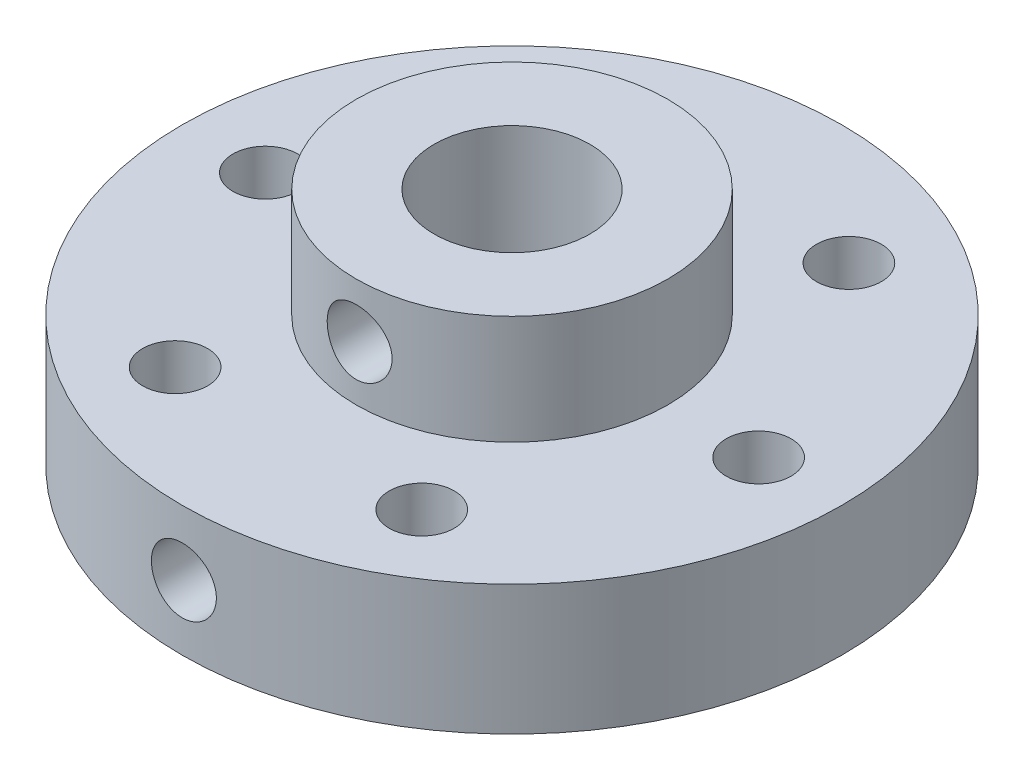
ISO-10303-21;
HEADER;
FILE_DESCRIPTION(('STEP AP214'),'2;1');
FILE_NAME('part.step','',(''),(''),'','','');
FILE_SCHEMA(('AUTOMOTIVE_DESIGN { 1 0 10303 214 1 1 1 1 }'));
ENDSEC;
DATA;
#1=APPLICATION_CONTEXT('core data for automotive mechanical design processes');
#2=APPLICATION_PROTOCOL_DEFINITION('international standard','automotive_design',2000,#1);
#3=PRODUCT_CONTEXT('',#1,'mechanical');
#4=PRODUCT('Part','Part','',(#3));
#5=PRODUCT_RELATED_PRODUCT_CATEGORY('part','',(#4));
#6=PRODUCT_DEFINITION_FORMATION('','',#4);
#7=PRODUCT_DEFINITION_CONTEXT('part definition',#1,'design');
#8=PRODUCT_DEFINITION('design','',#6,#7);
#9=PRODUCT_DEFINITION_SHAPE('','',#8);
#10=(LENGTH_UNIT() NAMED_UNIT(*) SI_UNIT(.MILLI.,.METRE.));
#11=(NAMED_UNIT(*) PLANE_ANGLE_UNIT() SI_UNIT($,.RADIAN.));
#12=(NAMED_UNIT(*) SI_UNIT($,.STERADIAN.) SOLID_ANGLE_UNIT());
#13=UNCERTAINTY_MEASURE_WITH_UNIT(LENGTH_MEASURE(1.E-05),#10,'distance_accuracy_value','');
#14=(GEOMETRIC_REPRESENTATION_CONTEXT(3) GLOBAL_UNCERTAINTY_ASSIGNED_CONTEXT((#13)) GLOBAL_UNIT_ASSIGNED_CONTEXT((#10,
#11,#12)) REPRESENTATION_CONTEXT('',''));
#15=CARTESIAN_POINT('',(0.,0.,0.));
#16=DIRECTION('',(0.,0.,1.));
#17=DIRECTION('',(1.,0.,0.));
#18=AXIS2_PLACEMENT_3D('',#15,#16,#17);
#19=CARTESIAN_POINT('',(12.7,0.,0.));
#20=DIRECTION('',(0.,-1.,0.));
#21=DIRECTION('',(0.,0.,-1.));
#22=AXIS2_PLACEMENT_3D('',#19,#20,#21);
#23=PLANE('',#22);
#24=CARTESIAN_POINT('',(-4.74999999999991,0.,-8.22724133595225));
#25=DIRECTION('',(0.,1.,0.));
#26=DIRECTION('',(0.,0.,1.));
#27=AXIS2_PLACEMENT_3D('',#24,#25,#26);
#28=CIRCLE('',#27,1.25);
#29=CARTESIAN_POINT('',(-4.74999999999991,0.,-6.97724133595225));
#30=VERTEX_POINT('',#29);
#31=EDGE_CURVE('E129',#30,#30,#28,.T.);
#32=ORIENTED_EDGE('',*,*,#31,.T.);
#33=EDGE_LOOP('',(#32));
#34=FACE_BOUND('',#33,.T.);
#35=CARTESIAN_POINT('',(4.75000000000025,0.,-8.2272413359522));
#36=DIRECTION('',(0.,1.,0.));
#37=DIRECTION('',(0.,0.,1.));
#38=AXIS2_PLACEMENT_3D('',#35,#36,#37);
#39=CIRCLE('',#38,1.25);
#40=CARTESIAN_POINT('',(4.75000000000025,0.,-6.9772413359522));
#41=VERTEX_POINT('',#40);
#42=EDGE_CURVE('E133',#41,#41,#39,.T.);
#43=ORIENTED_EDGE('',*,*,#42,.T.);
#44=EDGE_LOOP('',(#43));
#45=FACE_BOUND('',#44,.T.);
#46=CARTESIAN_POINT('',(9.50000000000026,0.,1.08637057683048E-13));
#47=DIRECTION('',(0.,1.,0.));
#48=DIRECTION('',(0.,0.,1.));
#49=AXIS2_PLACEMENT_3D('',#46,#47,#48);
#50=CIRCLE('',#49,1.25);
#51=CARTESIAN_POINT('',(9.50000000000026,0.,1.25000000000011));
#52=VERTEX_POINT('',#51);
#53=EDGE_CURVE('E137',#52,#52,#50,.T.);
#54=ORIENTED_EDGE('',*,*,#53,.T.);
#55=EDGE_LOOP('',(#54));
#56=FACE_BOUND('',#55,.T.);
#57=CARTESIAN_POINT('',(4.75000000000016,0.,8.22724133595238));
#58=DIRECTION('',(0.,1.,0.));
#59=DIRECTION('',(0.,0.,1.));
#60=AXIS2_PLACEMENT_3D('',#57,#58,#59);
#61=CIRCLE('',#60,1.25);
#62=CARTESIAN_POINT('',(4.75000000000016,0.,9.47724133595238));
#63=VERTEX_POINT('',#62);
#64=EDGE_CURVE('E141',#63,#63,#61,.T.);
#65=ORIENTED_EDGE('',*,*,#64,.T.);
#66=EDGE_LOOP('',(#65));
#67=FACE_BOUND('',#66,.T.);
#68=CARTESIAN_POINT('',(-4.74999999999999,0.,8.22724133595234));
#69=DIRECTION('',(0.,1.,0.));
#70=DIRECTION('',(0.,0.,1.));
#71=AXIS2_PLACEMENT_3D('',#68,#69,#70);
#72=CIRCLE('',#71,1.25);
#73=CARTESIAN_POINT('',(-4.74999999999999,0.,9.47724133595234));
#74=VERTEX_POINT('',#73);
#75=EDGE_CURVE('E145',#74,#74,#72,.T.);
#76=ORIENTED_EDGE('',*,*,#75,.T.);
#77=EDGE_LOOP('',(#76));
#78=FACE_BOUND('',#77,.T.);
#79=CARTESIAN_POINT('',(-9.5,0.,0.));
#80=DIRECTION('',(0.,1.,0.));
#81=DIRECTION('',(0.,0.,1.));
#82=AXIS2_PLACEMENT_3D('',#79,#80,#81);
#83=CIRCLE('',#82,1.25);
#84=CARTESIAN_POINT('',(-9.5,0.,1.25));
#85=VERTEX_POINT('',#84);
#86=EDGE_CURVE('E149',#85,#85,#83,.T.);
#87=ORIENTED_EDGE('',*,*,#86,.T.);
#88=EDGE_LOOP('',(#87));
#89=FACE_BOUND('',#88,.T.);
#90=CARTESIAN_POINT('',(0.,0.,0.));
#91=DIRECTION('',(0.,-1.,0.));
#92=DIRECTION('',(0.,0.,-1.));
#93=AXIS2_PLACEMENT_3D('',#90,#91,#92);
#94=CIRCLE('',#93,12.7);
#95=CARTESIAN_POINT('',(0.,0.,-12.7));
#96=VERTEX_POINT('',#95);
#97=EDGE_CURVE('E153',#96,#96,#94,.T.);
#98=ORIENTED_EDGE('',*,*,#97,.T.);
#99=EDGE_LOOP('',(#98));
#100=FACE_BOUND('',#99,.T.);
#101=CARTESIAN_POINT('',(0.,0.,0.));
#102=DIRECTION('',(0.,-1.,0.));
#103=DIRECTION('',(0.,0.,-1.));
#104=AXIS2_PLACEMENT_3D('',#101,#102,#103);
#105=CIRCLE('',#104,3.);
#106=CARTESIAN_POINT('',(0.,0.,-3.));
#107=VERTEX_POINT('',#106);
#108=EDGE_CURVE('E56',#107,#107,#105,.T.);
#109=ORIENTED_EDGE('',*,*,#108,.F.);
#110=EDGE_LOOP('',(#109));
#111=FACE_BOUND('',#110,.T.);
#112=ADVANCED_FACE('F43',(#34,#45,#56,#67,#78,#89,#100,#111),#23,.T.);
#113=CARTESIAN_POINT('',(0.,0.,0.));
#114=DIRECTION('',(0.,-1.,0.));
#115=DIRECTION('',(0.,0.,-1.));
#116=AXIS2_PLACEMENT_3D('',#113,#114,#115);
#117=CYLINDRICAL_SURFACE('',#116,3.);
#118=CARTESIAN_POINT('',(-1.24999999999999,7.1,2.72717802865893));
#119=CARTESIAN_POINT('',(-1.24999259066567,7.16667189089685,2.7271851956322));
#120=CARTESIAN_POINT('',(-1.24463203881502,7.23345265682621,2.72965859534401));
#121=CARTESIAN_POINT('',(-1.22339678947784,7.36508694205714,2.73923833650884));
#122=CARTESIAN_POINT('',(-1.20749354003276,7.42993472667523,2.74635725824267));
#123=CARTESIAN_POINT('',(-1.1658998841945,7.55556112969107,2.76426917574768));
#124=CARTESIAN_POINT('',(-1.14024937431427,7.61635516371501,2.77504717562616));
#125=CARTESIAN_POINT('',(-1.08000637754462,7.73275944957805,2.79904148565793));
#126=CARTESIAN_POINT('',(-1.04541600591531,7.78837092343312,2.81225721880783));
#127=CARTESIAN_POINT('',(-0.965973882676161,7.89632572497346,2.84055762619857));
#128=CARTESIAN_POINT('',(-0.920653238184403,7.94830755874409,2.85570568079146));
#129=CARTESIAN_POINT('',(-0.822021675745545,8.04420022249755,2.88564295372227));
#130=CARTESIAN_POINT('',(-0.768707691373999,8.08810794061301,2.90043203180789));
#131=CARTESIAN_POINT('',(-0.652763393797344,8.16844953087927,2.92875537930614));
#132=CARTESIAN_POINT('',(-0.589829293683655,8.20447662803234,2.94220739975291));
#133=CARTESIAN_POINT('',(-0.458132022362349,8.2652760205056,2.96556519993426));
#134=CARTESIAN_POINT('',(-0.389371454872121,8.29005331196421,2.97547255347157));
#135=CARTESIAN_POINT('',(-0.251768498025163,8.32633945875673,2.99017521042367));
#136=CARTESIAN_POINT('',(-0.183116576196079,8.33847169490204,2.99520971127466));
#137=CARTESIAN_POINT('',(-0.0445791803650053,8.35113764115985,3.00046828611204));
#138=CARTESIAN_POINT('',(0.0253057817645168,8.35167605588295,3.00069431131015));
#139=CARTESIAN_POINT('',(0.159792780112568,8.34146571906667,2.99645129133057));
#140=CARTESIAN_POINT('',(0.224457488607313,8.33140189947427,2.99226714648664));
#141=CARTESIAN_POINT('',(0.351082893931455,8.30144689736183,2.98006516750309));
#142=CARTESIAN_POINT('',(0.413043391054914,8.28155499036983,2.97204705074577));
#143=CARTESIAN_POINT('',(0.533638118077524,8.23227195910535,2.95279852414029));
#144=CARTESIAN_POINT('',(0.592207177074904,8.20274053712917,2.94152097126085));
#145=CARTESIAN_POINT('',(0.703711767281961,8.13515424329965,2.91685713989805));
#146=CARTESIAN_POINT('',(0.756645297756971,8.09709635915501,2.90347011666255));
#147=CARTESIAN_POINT('',(0.85934091170792,8.01041757959537,2.87481698777061));
#148=CARTESIAN_POINT('',(0.908616437316237,7.96124120872098,2.8594849435601));
#149=CARTESIAN_POINT('',(0.998431414927664,7.85528855929341,2.8293786068147));
#150=CARTESIAN_POINT('',(1.03896749582431,7.7985093617079,2.8146045313137));
#151=CARTESIAN_POINT('',(1.11140189250063,7.67660496333808,2.78681612355339));
#152=CARTESIAN_POINT('',(1.1429725335554,7.61126679425671,2.77387558556715));
#153=CARTESIAN_POINT('',(1.19446432058391,7.4755189550255,2.75209844221011));
#154=CARTESIAN_POINT('',(1.21439379627312,7.40511295173045,2.74325890334594));
#155=CARTESIAN_POINT('',(1.2408002516812,7.266103191086,2.73141212519724));
#156=CARTESIAN_POINT('',(1.24806614632865,7.19767887774094,2.72806369197117));
#157=CARTESIAN_POINT('',(1.25125630518998,7.0605215175885,2.72660286810642));
#158=CARTESIAN_POINT('',(1.24718449318148,6.99178858580829,2.72848866599319));
#159=CARTESIAN_POINT('',(1.22853477565555,6.86060161456955,2.7369313134575));
#160=CARTESIAN_POINT('',(1.21464618818048,6.7980273132132,2.74318138016618));
#161=CARTESIAN_POINT('',(1.17767058564225,6.67614870350213,2.75925630297447));
#162=CARTESIAN_POINT('',(1.15458142053124,6.61684516316929,2.76908199460161));
#163=CARTESIAN_POINT('',(1.09877520805186,6.50038468964353,2.79170797857));
#164=CARTESIAN_POINT('',(1.06569183306197,6.44342502538968,2.80461662202282));
#165=CARTESIAN_POINT('',(0.991200784385964,6.33559194750098,2.83180003740794));
#166=CARTESIAN_POINT('',(0.94978950787598,6.28472118329813,2.84607539920583));
#167=CARTESIAN_POINT('',(0.855844455715498,6.186199865116,2.87578619784533));
#168=CARTESIAN_POINT('',(0.802679661479732,6.13914860004934,2.89122146708842));
#169=CARTESIAN_POINT('',(0.688851512553533,6.05452770802067,2.92043361183923));
#170=CARTESIAN_POINT('',(0.628187608803651,6.0169587759363,2.93421036577014));
#171=CARTESIAN_POINT('',(0.50065468080338,5.95241012455643,2.9586425158565));
#172=CARTESIAN_POINT('',(0.433770169638502,5.92545775871053,2.96928983138826));
#173=CARTESIAN_POINT('',(0.295858835154413,5.88338320766558,2.98618173103366));
#174=CARTESIAN_POINT('',(0.224834504225192,5.86825398177394,2.9924289351992));
#175=CARTESIAN_POINT('',(0.0860165335064084,5.8511418744797,2.9995153479751));
#176=CARTESIAN_POINT('',(0.0183440847938956,5.84831400030304,3.00070204534225));
#177=CARTESIAN_POINT('',(-0.116486811714287,5.85361314129395,2.99849523480953));
#178=CARTESIAN_POINT('',(-0.183645347541156,5.86173823601287,2.99510252984313));
#179=CARTESIAN_POINT('',(-0.313086482449185,5.88810607215867,2.98430065981734));
#180=CARTESIAN_POINT('',(-0.375457537843569,5.90597968046956,2.97703824209233));
#181=CARTESIAN_POINT('',(-0.49629223050133,5.95093424720914,2.95929499847058));
#182=CARTESIAN_POINT('',(-0.554755122985826,5.97801695466491,2.94881356124207));
#183=CARTESIAN_POINT('',(-0.66902456547878,6.04198952921447,2.92505825398662));
#184=CARTESIAN_POINT('',(-0.724591657976681,6.079267301424,2.91167959188766));
#185=CARTESIAN_POINT('',(-0.828918675638779,6.1620071828719,2.88371561874231));
#186=CARTESIAN_POINT('',(-0.87767606178604,6.20747233040676,2.86912986083797));
#187=CARTESIAN_POINT('',(-0.970449787231577,6.30894482585441,2.83914845259141));
#188=CARTESIAN_POINT('',(-1.01391775364847,6.36545901462113,2.82376522857896));
#189=CARTESIAN_POINT('',(-1.09083332306674,6.4854587406802,2.79495552690186));
#190=CARTESIAN_POINT('',(-1.12427532456754,6.54894814805815,2.78153014522558));
#191=CARTESIAN_POINT('',(-1.17982766043577,6.68094383502275,2.75842557732643));
#192=CARTESIAN_POINT('',(-1.20199823632853,6.74942115879321,2.74872654469865));
#193=CARTESIAN_POINT('',(-1.234235564538,6.88953957385067,2.73440803066668));
#194=CARTESIAN_POINT('',(-1.24434291521209,6.9611692072743,2.72977151604981));
#195=CARTESIAN_POINT('',(-1.24940464923649,7.05535852426189,2.72744979732688));
#196=CARTESIAN_POINT('',(-1.25000248121118,7.07767315738803,2.72717562860875));
#197=CARTESIAN_POINT('',(-1.24999999999999,7.1,2.72717802865893));
#198=B_SPLINE_CURVE_WITH_KNOTS('',3,(#118,#119,#120,#121,#122,#123,#124,#125,#126,#127,#128,
#129,#130,#131,#132,#133,#134,#135,#136,#137,#138,#139,#140,#141,#142,#143,#144,#145,#146,#147,
#148,#149,#150,#151,#152,#153,#154,#155,#156,#157,#158,#159,#160,#161,#162,#163,#164,#165,#166,
#167,#168,#169,#170,#171,#172,#173,#174,#175,#176,#177,#178,#179,#180,#181,#182,#183,#184,#185,
#186,#187,#188,#189,#190,#191,#192,#193,#194,#195,#196,#197),.UNSPECIFIED.,.T.,.F.,(4,2,2,2,2,2,
2,2,2,2,2,2,2,2,2,2,2,2,2,2,2,2,2,2,2,2,2,2,2,2,2,2,2,2,2,2,2,2,2,4),(0.,0.199951711985514,
0.400447161842174,0.600130652152108,0.799766938550096,1.01066841430653,1.2216510045991,
1.44178476577923,1.6618206677489,1.87040605977951,2.07890680917929,2.27471840245092,
2.47054443201882,2.66935814640064,2.86824221022483,3.08114531844483,3.29413040441365,
3.5141154566672,3.73394290745567,3.93950778306306,4.14500152518447,4.3373390106619,
4.52972146913527,4.73025126818167,4.93086800795463,5.14781662735511,5.36478114041864,
5.58230105955592,5.79969134643005,6.0018863509405,6.20404590801911,6.39903415036484,
6.59405944632169,6.79789862829033,7.00181361048901,7.21960426908074,7.43751638139185,
7.65425125796861,7.87025464546159,7.93721375436701),.UNSPECIFIED.);
#199=CARTESIAN_POINT('',(-1.24999999999999,7.1,2.72717802865893));
#200=VERTEX_POINT('',#199);
#201=EDGE_CURVE('E93',#200,#200,#198,.T.);
#202=ORIENTED_EDGE('',*,*,#201,.F.);
#203=EDGE_LOOP('',(#202));
#204=FACE_BOUND('',#203,.T.);
#205=CARTESIAN_POINT('',(-1.24999999999999,2.5,2.72717802865893));
#206=CARTESIAN_POINT('',(-1.24999259066567,2.56667189089685,2.7271851956322));
#207=CARTESIAN_POINT('',(-1.24463203881502,2.63345265682621,2.72965859534401));
#208=CARTESIAN_POINT('',(-1.22339678947784,2.76508694205714,2.73923833650884));
#209=CARTESIAN_POINT('',(-1.20749354003276,2.82993472667523,2.74635725824267));
#210=CARTESIAN_POINT('',(-1.1658998841945,2.95556112969107,2.76426917574768));
#211=CARTESIAN_POINT('',(-1.14024937431427,3.01635516371501,2.77504717562616));
#212=CARTESIAN_POINT('',(-1.08000637754462,3.13275944957805,2.79904148565793));
#213=CARTESIAN_POINT('',(-1.04541600591531,3.18837092343312,2.81225721880783));
#214=CARTESIAN_POINT('',(-0.965973882676161,3.29632572497346,2.84055762619857));
#215=CARTESIAN_POINT('',(-0.920653238184403,3.34830755874409,2.85570568079146));
#216=CARTESIAN_POINT('',(-0.822021675745545,3.44420022249755,2.88564295372227));
#217=CARTESIAN_POINT('',(-0.768707691373999,3.48810794061301,2.90043203180789));
#218=CARTESIAN_POINT('',(-0.652763393797344,3.56844953087927,2.92875537930613));
#219=CARTESIAN_POINT('',(-0.589829293683655,3.60447662803234,2.94220739975291));
#220=CARTESIAN_POINT('',(-0.458132022362349,3.6652760205056,2.96556519993426));
#221=CARTESIAN_POINT('',(-0.389371454872121,3.69005331196421,2.97547255347157));
#222=CARTESIAN_POINT('',(-0.251768498025164,3.72633945875673,2.99017521042367));
#223=CARTESIAN_POINT('',(-0.183116576196079,3.73847169490204,2.99520971127466));
#224=CARTESIAN_POINT('',(-0.0445791803650054,3.75113764115985,3.00046828611204));
#225=CARTESIAN_POINT('',(0.0253057817645166,3.75167605588295,3.00069431131015));
#226=CARTESIAN_POINT('',(0.159792780112568,3.74146571906667,2.99645129133057));
#227=CARTESIAN_POINT('',(0.224457488607313,3.73140189947427,2.99226714648664));
#228=CARTESIAN_POINT('',(0.351082893931455,3.70144689736183,2.98006516750309));
#229=CARTESIAN_POINT('',(0.413043391054914,3.68155499036983,2.97204705074577));
#230=CARTESIAN_POINT('',(0.533638118077523,3.63227195910535,2.95279852414029));
#231=CARTESIAN_POINT('',(0.592207177074903,3.60274053712917,2.94152097126085));
#232=CARTESIAN_POINT('',(0.70371176728196,3.53515424329965,2.91685713989805));
#233=CARTESIAN_POINT('',(0.756645297756971,3.49709635915501,2.90347011666255));
#234=CARTESIAN_POINT('',(0.85934091170792,3.41041757959538,2.87481698777061));
#235=CARTESIAN_POINT('',(0.908616437316236,3.36124120872099,2.8594849435601));
#236=CARTESIAN_POINT('',(0.998431414927663,3.25528855929341,2.8293786068147));
#237=CARTESIAN_POINT('',(1.03896749582431,3.1985093617079,2.8146045313137));
#238=CARTESIAN_POINT('',(1.11140189250063,3.07660496333808,2.78681612355339));
#239=CARTESIAN_POINT('',(1.1429725335554,3.01126679425671,2.77387558556715));
#240=CARTESIAN_POINT('',(1.19446432058391,2.8755189550255,2.75209844221011));
#241=CARTESIAN_POINT('',(1.21439379627312,2.80511295173045,2.74325890334594));
#242=CARTESIAN_POINT('',(1.2408002516812,2.666103191086,2.73141212519724));
#243=CARTESIAN_POINT('',(1.24806614632865,2.59767887774095,2.72806369197117));
#244=CARTESIAN_POINT('',(1.25125630518998,2.4605215175885,2.72660286810642));
#245=CARTESIAN_POINT('',(1.24718449318148,2.39178858580829,2.72848866599319));
#246=CARTESIAN_POINT('',(1.22853477565555,2.26060161456955,2.73693131345749));
#247=CARTESIAN_POINT('',(1.21464618818048,2.1980273132132,2.74318138016618));
#248=CARTESIAN_POINT('',(1.17767058564225,2.07614870350213,2.75925630297447));
#249=CARTESIAN_POINT('',(1.15458142053124,2.01684516316929,2.76908199460161));
#250=CARTESIAN_POINT('',(1.09877520805186,1.90038468964353,2.79170797857));
#251=CARTESIAN_POINT('',(1.06569183306197,1.84342502538968,2.80461662202282));
#252=CARTESIAN_POINT('',(0.991200784385964,1.73559194750098,2.83180003740794));
#253=CARTESIAN_POINT('',(0.949789507875981,1.68472118329813,2.84607539920583));
#254=CARTESIAN_POINT('',(0.855844455715499,1.586199865116,2.87578619784533));
#255=CARTESIAN_POINT('',(0.802679661479732,1.53914860004934,2.89122146708842));
#256=CARTESIAN_POINT('',(0.688851512553533,1.45452770802067,2.92043361183923));
#257=CARTESIAN_POINT('',(0.628187608803651,1.4169587759363,2.93421036577014));
#258=CARTESIAN_POINT('',(0.50065468080338,1.35241012455643,2.9586425158565));
#259=CARTESIAN_POINT('',(0.433770169638502,1.32545775871053,2.96928983138826));
#260=CARTESIAN_POINT('',(0.295858835154413,1.28338320766558,2.98618173103366));
#261=CARTESIAN_POINT('',(0.224834504225192,1.26825398177394,2.9924289351992));
#262=CARTESIAN_POINT('',(0.0860165335064089,1.2511418744797,2.9995153479751));
#263=CARTESIAN_POINT('',(0.0183440847938962,1.24831400030304,3.00070204534225));
#264=CARTESIAN_POINT('',(-0.116486811714286,1.25361314129395,2.99849523480953));
#265=CARTESIAN_POINT('',(-0.183645347541156,1.26173823601287,2.99510252984313));
#266=CARTESIAN_POINT('',(-0.313086482449185,1.28810607215867,2.98430065981734));
#267=CARTESIAN_POINT('',(-0.375457537843569,1.30597968046956,2.97703824209233));
#268=CARTESIAN_POINT('',(-0.49629223050133,1.35093424720914,2.95929499847058));
#269=CARTESIAN_POINT('',(-0.554755122985826,1.37801695466491,2.94881356124207));
#270=CARTESIAN_POINT('',(-0.66902456547878,1.44198952921447,2.92505825398662));
#271=CARTESIAN_POINT('',(-0.72459165797668,1.479267301424,2.91167959188766));
#272=CARTESIAN_POINT('',(-0.828918675638779,1.5620071828719,2.88371561874231));
#273=CARTESIAN_POINT('',(-0.87767606178604,1.60747233040676,2.86912986083797));
#274=CARTESIAN_POINT('',(-0.970449787231577,1.70894482585441,2.83914845259141));
#275=CARTESIAN_POINT('',(-1.01391775364847,1.76545901462113,2.82376522857896));
#276=CARTESIAN_POINT('',(-1.09083332306674,1.8854587406802,2.79495552690186));
#277=CARTESIAN_POINT('',(-1.12427532456754,1.94894814805815,2.78153014522558));
#278=CARTESIAN_POINT('',(-1.17982766043576,2.08094383502276,2.75842557732643));
#279=CARTESIAN_POINT('',(-1.20199823632853,2.14942115879321,2.74872654469865));
#280=CARTESIAN_POINT('',(-1.234235564538,2.28953957385067,2.73440803066668));
#281=CARTESIAN_POINT('',(-1.24434291521209,2.3611692072743,2.72977151604981));
#282=CARTESIAN_POINT('',(-1.24940464923649,2.45535852426189,2.72744979732688));
#283=CARTESIAN_POINT('',(-1.25000248121118,2.47767315738804,2.72717562860875));
#284=CARTESIAN_POINT('',(-1.24999999999999,2.5,2.72717802865893));
#285=B_SPLINE_CURVE_WITH_KNOTS('',3,(#205,#206,#207,#208,#209,#210,#211,#212,#213,#214,#215,
#216,#217,#218,#219,#220,#221,#222,#223,#224,#225,#226,#227,#228,#229,#230,#231,#232,#233,#234,
#235,#236,#237,#238,#239,#240,#241,#242,#243,#244,#245,#246,#247,#248,#249,#250,#251,#252,#253,
#254,#255,#256,#257,#258,#259,#260,#261,#262,#263,#264,#265,#266,#267,#268,#269,#270,#271,#272,
#273,#274,#275,#276,#277,#278,#279,#280,#281,#282,#283,#284),.UNSPECIFIED.,.T.,.F.,(4,2,2,2,2,2,
2,2,2,2,2,2,2,2,2,2,2,2,2,2,2,2,2,2,2,2,2,2,2,2,2,2,2,2,2,2,2,2,2,4),(0.,0.199951711985514,
0.400447161842173,0.600130652152108,0.799766938550096,1.01066841430653,1.2216510045991,
1.44178476577923,1.6618206677489,1.87040605977951,2.07890680917929,2.27471840245092,
2.47054443201882,2.66935814640064,2.86824221022482,3.08114531844483,3.29413040441365,
3.5141154566672,3.73394290745567,3.93950778306305,4.14500152518446,4.3373390106619,
4.52972146913527,4.73025126818167,4.93086800795463,5.14781662735511,5.36478114041864,
5.58230105955592,5.79969134643004,6.0018863509405,6.20404590801911,6.39903415036484,
6.59405944632169,6.79789862829033,7.00181361048901,7.21960426908074,7.43751638139185,
7.65425125796861,7.87025464546159,7.93721375436701),.UNSPECIFIED.);
#286=CARTESIAN_POINT('',(-1.24999999999999,2.5,2.72717802865893));
#287=VERTEX_POINT('',#286);
#288=EDGE_CURVE('E84',#287,#287,#285,.T.);
#289=ORIENTED_EDGE('',*,*,#288,.F.);
#290=EDGE_LOOP('',(#289));
#291=FACE_BOUND('',#290,.T.);
#292=ORIENTED_EDGE('',*,*,#108,.T.);
#293=EDGE_LOOP('',(#292));
#294=FACE_BOUND('',#293,.T.);
#295=CARTESIAN_POINT('',(0.,9.2,0.));
#296=DIRECTION('',(0.,-1.,0.));
#297=DIRECTION('',(0.,0.,-1.));
#298=AXIS2_PLACEMENT_3D('',#295,#296,#297);
#299=CIRCLE('',#298,3.);
#300=CARTESIAN_POINT('',(0.,9.2,-3.));
#301=VERTEX_POINT('',#300);
#302=EDGE_CURVE('E61',#301,#301,#299,.T.);
#303=ORIENTED_EDGE('',*,*,#302,.F.);
#304=EDGE_LOOP('',(#303));
#305=FACE_BOUND('',#304,.T.);
#306=ADVANCED_FACE('F98',(#204,#291,#294,#305),#117,.F.);
#307=CARTESIAN_POINT('',(3.,9.2,0.));
#308=DIRECTION('',(0.,1.,0.));
#309=DIRECTION('',(0.,0.,1.));
#310=AXIS2_PLACEMENT_3D('',#307,#308,#309);
#311=PLANE('',#310);
#312=ORIENTED_EDGE('',*,*,#302,.T.);
#313=EDGE_LOOP('',(#312));
#314=FACE_BOUND('',#313,.T.);
#315=CARTESIAN_POINT('',(0.,9.2,0.));
#316=DIRECTION('',(0.,-1.,0.));
#317=DIRECTION('',(0.,0.,-1.));
#318=AXIS2_PLACEMENT_3D('',#315,#316,#317);
#319=CIRCLE('',#318,6.);
#320=CARTESIAN_POINT('',(0.,9.2,-6.));
#321=VERTEX_POINT('',#320);
#322=EDGE_CURVE('E160',#321,#321,#319,.T.);
#323=ORIENTED_EDGE('',*,*,#322,.F.);
#324=EDGE_LOOP('',(#323));
#325=FACE_BOUND('',#324,.T.);
#326=ADVANCED_FACE('F102',(#314,#325),#311,.T.);
#327=CARTESIAN_POINT('',(0.,0.,0.));
#328=DIRECTION('',(0.,-1.,0.));
#329=DIRECTION('',(0.,0.,-1.));
#330=AXIS2_PLACEMENT_3D('',#327,#328,#329);
#331=CYLINDRICAL_SURFACE('',#330,6.);
#332=CARTESIAN_POINT('',(-1.24999999999999,7.1,5.86834729715275));
#333=CARTESIAN_POINT('',(-1.24999750877599,7.03060938484897,5.86834869213645));
#334=CARTESIAN_POINT('',(-1.24420229433947,6.96118802798478,5.86959145924544));
#335=CARTESIAN_POINT('',(-1.22119649233778,6.82431368268275,5.87442015581798));
#336=CARTESIAN_POINT('',(-1.20397715440341,6.75686224449358,5.87800788138388));
#337=CARTESIAN_POINT('',(-1.1586839750723,6.62592762716513,5.8871029296193));
#338=CARTESIAN_POINT('',(-1.13062141248932,6.5624404040082,5.89260825706945));
#339=CARTESIAN_POINT('',(-1.06446988601732,6.4410755003544,5.90491581335741));
#340=CARTESIAN_POINT('',(-1.02638132735819,6.38319759326998,5.91171798977623));
#341=CARTESIAN_POINT('',(-0.940636399466078,6.27380462484654,5.92596934661468));
#342=CARTESIAN_POINT('',(-0.892855554869664,6.22238810637353,5.93342614373039));
#343=CARTESIAN_POINT('',(-0.789351223880632,6.1282389313519,5.94807966802575));
#344=CARTESIAN_POINT('',(-0.733627155455998,6.08550691170856,5.95527637609915));
#345=CARTESIAN_POINT('',(-0.615162052999585,6.00955411191714,5.96868135118848));
#346=CARTESIAN_POINT('',(-0.552359428204938,5.97642747353674,5.97487958631242));
#347=CARTESIAN_POINT('',(-0.421928551006718,5.92123394714023,5.98550347343302));
#348=CARTESIAN_POINT('',(-0.354300789950589,5.89916593484647,5.98992930561222));
#349=CARTESIAN_POINT('',(-0.217162904200501,5.86702423888253,5.99645589892179));
#350=CARTESIAN_POINT('',(-0.147693380916357,5.85678398280484,5.99858891959926));
#351=CARTESIAN_POINT('',(-0.00799184883952444,5.84806830424299,6.00040112580612));
#352=CARTESIAN_POINT('',(0.0622400797368381,5.8495916558069,6.0000805670369));
#353=CARTESIAN_POINT('',(0.200326586199571,5.86423460095675,5.99704658090511));
#354=CARTESIAN_POINT('',(0.268201128726474,5.87717471895812,5.99437018956584));
#355=CARTESIAN_POINT('',(0.40079374628975,5.91399862533131,5.98696720898885));
#356=CARTESIAN_POINT('',(0.46551168751102,5.93788287720308,5.98224053291904));
#357=CARTESIAN_POINT('',(0.590460005384681,5.9960800521255,5.97120767323924));
#358=CARTESIAN_POINT('',(0.650657134981647,6.03046229420966,5.96489104125346));
#359=CARTESIAN_POINT('',(0.764493456510645,6.10862800284042,5.95137300440189));
#360=CARTESIAN_POINT('',(0.818131831816415,6.15241263820613,5.94417148958325));
#361=CARTESIAN_POINT('',(0.918394203276908,6.24912162489106,5.92951700233276));
#362=CARTESIAN_POINT('',(0.964866487494789,6.30220305998195,5.92206184975925));
#363=CARTESIAN_POINT('',(1.04827597240487,6.4154820489948,5.90786872648996));
#364=CARTESIAN_POINT('',(1.08521296069979,6.47567976138724,5.9011307717716));
#365=CARTESIAN_POINT('',(1.14856217138454,6.6017122548288,5.88912998409156));
#366=CARTESIAN_POINT('',(1.17494805489727,6.66756065069343,5.88387085232125));
#367=CARTESIAN_POINT('',(1.21623577538672,6.80289161936938,5.8754760641036));
#368=CARTESIAN_POINT('',(1.23113924882348,6.87237367280809,5.87234010507182));
#369=CARTESIAN_POINT('',(1.24880863867017,7.0116197063189,5.86860783239132));
#370=CARTESIAN_POINT('',(1.25179442917998,7.08135458453703,5.86796551863474));
#371=CARTESIAN_POINT('',(1.24613693439294,7.22032581154014,5.86916952018704));
#372=CARTESIAN_POINT('',(1.23749436857862,7.28956219090233,5.87101568152624));
#373=CARTESIAN_POINT('',(1.20901558325483,7.42482051605812,5.87694538226166));
#374=CARTESIAN_POINT('',(1.18929841376871,7.49086866717883,5.88100511282998));
#375=CARTESIAN_POINT('',(1.13935810860919,7.6187239894416,5.8908833850312));
#376=CARTESIAN_POINT('',(1.10913404556146,7.6805307856504,5.89670208191057));
#377=CARTESIAN_POINT('',(1.03854598181484,7.79910644121622,5.90954501937191));
#378=CARTESIAN_POINT('',(0.998045327353957,7.85579220446616,5.91658506648323));
#379=CARTESIAN_POINT('',(0.908234440569875,7.96164324915506,5.93103483993908));
#380=CARTESIAN_POINT('',(0.858923220505169,8.01080768623922,5.93844460766532));
#381=CARTESIAN_POINT('',(0.751900450843336,8.10106271309716,5.95294924316736));
#382=CARTESIAN_POINT('',(0.694061907614549,8.14200409502637,5.9600367471991));
#383=CARTESIAN_POINT('',(0.572200102216357,8.21358875208797,5.97296708772407));
#384=CARTESIAN_POINT('',(0.508177113476879,8.24423248223744,5.97880997920818));
#385=CARTESIAN_POINT('',(0.376142117847917,8.29413867931734,5.98856148270679));
#386=CARTESIAN_POINT('',(0.308156710970193,8.31346916554433,5.99248163136497));
#387=CARTESIAN_POINT('',(0.169813400503472,8.34041440400809,5.99799561410226));
#388=CARTESIAN_POINT('',(0.0994558094616954,8.34803069353273,5.99958975342889));
#389=CARTESIAN_POINT('',(-0.0402133434703382,8.35126762204851,6.00026408056941));
#390=CARTESIAN_POINT('',(-0.109519592177921,8.34711189999472,5.99939113754811));
#391=CARTESIAN_POINT('',(-0.246422870373551,8.32741936134706,5.99532874094472));
#392=CARTESIAN_POINT('',(-0.314019925202701,8.31188271359322,5.99213932172839));
#393=CARTESIAN_POINT('',(-0.445431965492049,8.26997220535143,5.98380460077544));
#394=CARTESIAN_POINT('',(-0.50925655000452,8.24362733614689,5.97866453407556));
#395=CARTESIAN_POINT('',(-0.631610567220737,8.18087760226799,5.96697995347704));
#396=CARTESIAN_POINT('',(-0.690139538279507,8.14447186165686,5.96043531730246));
#397=CARTESIAN_POINT('',(-0.801340321298256,8.06189033200669,5.94651596786386));
#398=CARTESIAN_POINT('',(-0.853892633615922,8.01555571194329,5.93912880302851));
#399=CARTESIAN_POINT('',(-0.95055274198038,7.91475549900291,5.9244278681135));
#400=CARTESIAN_POINT('',(-0.994658521571227,7.86028797005156,5.91711411595368));
#401=CARTESIAN_POINT('',(-1.07367451852767,7.74399089756656,5.90329191643327));
#402=CARTESIAN_POINT('',(-1.10846928126993,7.6820815885379,5.89679406702551));
#403=CARTESIAN_POINT('',(-1.16710627925306,7.55317484391673,5.88547039658063));
#404=CARTESIAN_POINT('',(-1.19095816292459,7.48618195154699,5.88064310352601));
#405=CARTESIAN_POINT('',(-1.2225655413186,7.36589371843156,5.87414004405196));
#406=CARTESIAN_POINT('',(-1.2328344900567,7.31327046340694,5.87198163591589));
#407=CARTESIAN_POINT('',(-1.24655254358403,7.20710421947899,5.86908475266778));
#408=CARTESIAN_POINT('',(-1.2500019229274,7.15356126768995,5.86834622039193));
#409=CARTESIAN_POINT('',(-1.24999999999999,7.1,5.86834729715275));
#410=B_SPLINE_CURVE_WITH_KNOTS('',3,(#332,#333,#334,#335,#336,#337,#338,#339,#340,#341,#342,
#343,#344,#345,#346,#347,#348,#349,#350,#351,#352,#353,#354,#355,#356,#357,#358,#359,#360,#361,
#362,#363,#364,#365,#366,#367,#368,#369,#370,#371,#372,#373,#374,#375,#376,#377,#378,#379,#380,
#381,#382,#383,#384,#385,#386,#387,#388,#389,#390,#391,#392,#393,#394,#395,#396,#397,#398,#399,
#400,#401,#402,#403,#404,#405,#406,#407,#408,#409),.UNSPECIFIED.,.T.,.F.,(4,2,2,2,2,2,2,2,2,2,2,
2,2,2,2,2,2,2,2,2,2,2,2,2,2,2,2,2,2,2,2,2,2,2,2,2,2,2,4),(0.,0.207975654071269,
0.416110792417468,0.624030014802726,0.831940834815787,1.04271333467884,1.25350128663873,
1.46629026266843,1.67905760106932,1.88879048859263,2.09850151896338,2.3049734141646,
2.51145405455869,2.71932871977948,2.92722924104258,3.13905862244912,3.35089272191626,
3.56325237332486,3.77558175387595,3.9839751600979,4.19235567296522,4.3985378623192,
4.60473825464028,4.81383917934648,5.02296356082183,5.23559458753341,5.44821621759037,
5.65954599648531,5.87084803959578,6.07816293922642,6.28547476332978,6.49223410585097,
6.6990114552817,6.9093831897857,7.11980508427532,7.33272651358119,7.54545984571984,
7.70599867585766,7.86653104261157),.UNSPECIFIED.);
#411=CARTESIAN_POINT('',(-1.24999999999999,7.1,5.86834729715275));
#412=VERTEX_POINT('',#411);
#413=EDGE_CURVE('E46',#412,#412,#410,.T.);
#414=ORIENTED_EDGE('',*,*,#413,.F.);
#415=EDGE_LOOP('',(#414));
#416=FACE_BOUND('',#415,.T.);
#417=ORIENTED_EDGE('',*,*,#322,.T.);
#418=EDGE_LOOP('',(#417));
#419=FACE_BOUND('',#418,.T.);
#420=CARTESIAN_POINT('',(0.,5.,0.));
#421=DIRECTION('',(0.,-1.,0.));
#422=DIRECTION('',(0.,0.,-1.));
#423=AXIS2_PLACEMENT_3D('',#420,#421,#422);
#424=CIRCLE('',#423,6.);
#425=CARTESIAN_POINT('',(0.,5.,-6.));
#426=VERTEX_POINT('',#425);
#427=EDGE_CURVE('E163',#426,#426,#424,.T.);
#428=ORIENTED_EDGE('',*,*,#427,.F.);
#429=EDGE_LOOP('',(#428));
#430=FACE_BOUND('',#429,.T.);
#431=ADVANCED_FACE('F106',(#416,#419,#430),#331,.T.);
#432=CARTESIAN_POINT('',(6.,5.,0.));
#433=DIRECTION('',(0.,1.,0.));
#434=DIRECTION('',(0.,0.,1.));
#435=AXIS2_PLACEMENT_3D('',#432,#433,#434);
#436=PLANE('',#435);
#437=CARTESIAN_POINT('',(-4.74999999999991,5.,-8.22724133595225));
#438=DIRECTION('',(0.,1.,0.));
#439=DIRECTION('',(0.,0.,1.));
#440=AXIS2_PLACEMENT_3D('',#437,#438,#439);
#441=CIRCLE('',#440,1.25);
#442=CARTESIAN_POINT('',(-4.74999999999991,5.,-6.97724133595225));
#443=VERTEX_POINT('',#442);
#444=EDGE_CURVE('E92',#443,#443,#441,.T.);
#445=ORIENTED_EDGE('',*,*,#444,.F.);
#446=EDGE_LOOP('',(#445));
#447=FACE_BOUND('',#446,.T.);
#448=CARTESIAN_POINT('',(4.75000000000025,5.,-8.2272413359522));
#449=DIRECTION('',(0.,1.,0.));
#450=DIRECTION('',(0.,0.,1.));
#451=AXIS2_PLACEMENT_3D('',#448,#449,#450);
#452=CIRCLE('',#451,1.25);
#453=CARTESIAN_POINT('',(4.75000000000025,5.,-6.9772413359522));
#454=VERTEX_POINT('',#453);
#455=EDGE_CURVE('E201',#454,#454,#452,.T.);
#456=ORIENTED_EDGE('',*,*,#455,.F.);
#457=EDGE_LOOP('',(#456));
#458=FACE_BOUND('',#457,.T.);
#459=CARTESIAN_POINT('',(9.50000000000026,5.,1.08637057683048E-13));
#460=DIRECTION('',(0.,1.,0.));
#461=DIRECTION('',(0.,0.,1.));
#462=AXIS2_PLACEMENT_3D('',#459,#460,#461);
#463=CIRCLE('',#462,1.25);
#464=CARTESIAN_POINT('',(9.50000000000026,5.,1.25000000000011));
#465=VERTEX_POINT('',#464);
#466=EDGE_CURVE('E195',#465,#465,#463,.T.);
#467=ORIENTED_EDGE('',*,*,#466,.F.);
#468=EDGE_LOOP('',(#467));
#469=FACE_BOUND('',#468,.T.);
#470=CARTESIAN_POINT('',(4.75000000000016,5.,8.22724133595238));
#471=DIRECTION('',(0.,1.,0.));
#472=DIRECTION('',(0.,0.,1.));
#473=AXIS2_PLACEMENT_3D('',#470,#471,#472);
#474=CIRCLE('',#473,1.25);
#475=CARTESIAN_POINT('',(4.75000000000016,5.,9.47724133595238));
#476=VERTEX_POINT('',#475);
#477=EDGE_CURVE('E189',#476,#476,#474,.T.);
#478=ORIENTED_EDGE('',*,*,#477,.F.);
#479=EDGE_LOOP('',(#478));
#480=FACE_BOUND('',#479,.T.);
#481=CARTESIAN_POINT('',(-4.74999999999999,5.,8.22724133595234));
#482=DIRECTION('',(0.,1.,0.));
#483=DIRECTION('',(0.,0.,1.));
#484=AXIS2_PLACEMENT_3D('',#481,#482,#483);
#485=CIRCLE('',#484,1.25);
#486=CARTESIAN_POINT('',(-4.74999999999999,5.,9.47724133595234));
#487=VERTEX_POINT('',#486);
#488=EDGE_CURVE('E183',#487,#487,#485,.T.);
#489=ORIENTED_EDGE('',*,*,#488,.F.);
#490=EDGE_LOOP('',(#489));
#491=FACE_BOUND('',#490,.T.);
#492=CARTESIAN_POINT('',(-9.5,5.,0.));
#493=DIRECTION('',(0.,1.,0.));
#494=DIRECTION('',(0.,0.,1.));
#495=AXIS2_PLACEMENT_3D('',#492,#493,#494);
#496=CIRCLE('',#495,1.25);
#497=CARTESIAN_POINT('',(-9.5,5.,1.25));
#498=VERTEX_POINT('',#497);
#499=EDGE_CURVE('E177',#498,#498,#496,.T.);
#500=ORIENTED_EDGE('',*,*,#499,.F.);
#501=EDGE_LOOP('',(#500));
#502=FACE_BOUND('',#501,.T.);
#503=ORIENTED_EDGE('',*,*,#427,.T.);
#504=EDGE_LOOP('',(#503));
#505=FACE_BOUND('',#504,.T.);
#506=CARTESIAN_POINT('',(0.,5.,0.));
#507=DIRECTION('',(0.,-1.,0.));
#508=DIRECTION('',(0.,0.,-1.));
#509=AXIS2_PLACEMENT_3D('',#506,#507,#508);
#510=CIRCLE('',#509,12.7);
#511=CARTESIAN_POINT('',(0.,5.,-12.7));
#512=VERTEX_POINT('',#511);
#513=EDGE_CURVE('E169',#512,#512,#510,.T.);
#514=ORIENTED_EDGE('',*,*,#513,.F.);
#515=EDGE_LOOP('',(#514));
#516=FACE_BOUND('',#515,.T.);
#517=ADVANCED_FACE('F110',(#447,#458,#469,#480,#491,#502,#505,#516),#436,.T.);
#518=CARTESIAN_POINT('',(0.,0.,0.));
#519=DIRECTION('',(0.,-1.,0.));
#520=DIRECTION('',(0.,0.,-1.));
#521=AXIS2_PLACEMENT_3D('',#518,#519,#520);
#522=CYLINDRICAL_SURFACE('',#521,12.7);
#523=CARTESIAN_POINT('',(0.,1.25000000000001,12.7));
#524=CARTESIAN_POINT('',(0.0700312826447141,1.25000303546489,12.6999992053767));
#525=CARTESIAN_POINT('',(0.14010900678754,1.25590506924033,12.6994145852931));
#526=CARTESIAN_POINT('',(0.27832202784406,1.27936056646902,12.6971386355552));
#527=CARTESIAN_POINT('',(0.346455091701955,1.29692690368873,12.6954460831171));
#528=CARTESIAN_POINT('',(0.478757289636586,1.3431950211263,12.6911453487048));
#529=CARTESIAN_POINT('',(0.542928775594423,1.37189011935505,12.6885377162568));
#530=CARTESIAN_POINT('',(0.665530357530223,1.43958834239712,12.6826984877893));
#531=CARTESIAN_POINT('',(0.723961600791189,1.47858940161937,12.6794670168387));
#532=CARTESIAN_POINT('',(0.833642201405571,1.56593867561093,12.6727295439492));
#533=CARTESIAN_POINT('',(0.884868708381632,1.61431552194277,12.6692227211751));
#534=CARTESIAN_POINT('',(0.978489341246061,1.71898211143332,12.6623365830734));
#535=CARTESIAN_POINT('',(1.02088306075884,1.77527221846294,12.6589572736182));
#536=CARTESIAN_POINT('',(1.09571529914481,1.89431002660821,12.6527003451726));
#537=CARTESIAN_POINT('',(1.12813319805397,1.95707074991373,12.6498237705616));
#538=CARTESIAN_POINT('',(1.18196189962952,2.087177901841,12.6449081047838));
#539=CARTESIAN_POINT('',(1.20337296627196,2.15452422044288,12.6428689935324));
#540=CARTESIAN_POINT('',(1.23451262073334,2.2916581946059,12.6398664963312));
#541=CARTESIAN_POINT('',(1.24427904323655,2.36143718133028,12.6388996272722));
#542=CARTESIAN_POINT('',(1.25196912321573,2.50165010379155,12.6381402528445));
#543=CARTESIAN_POINT('',(1.24989308284717,2.57208402277234,12.6383477175131));
#544=CARTESIAN_POINT('',(1.23398836132345,2.71134679843134,12.6399103906683));
#545=CARTESIAN_POINT('',(1.22020097097041,2.7801804223952,12.6412615667039));
#546=CARTESIAN_POINT('',(1.18132916034646,2.91455192058459,12.6449531171045));
#547=CARTESIAN_POINT('',(1.15624459176253,2.98008975152931,12.647293504456));
#548=CARTESIAN_POINT('',(1.09544483971353,3.1061398371098,12.6527044143333));
#549=CARTESIAN_POINT('',(1.05971131587941,3.16664318915494,12.6557761946648));
#550=CARTESIAN_POINT('',(0.978641180257094,3.28080943580754,12.6623027037322));
#551=CARTESIAN_POINT('',(0.933304296235699,3.33447213642915,12.6657574433229));
#552=CARTESIAN_POINT('',(0.834083669760969,3.43367374710584,12.6726785733742));
#553=CARTESIAN_POINT('',(0.780164263845075,3.47917699540741,12.6761449506051));
#554=CARTESIAN_POINT('',(0.665433065104137,3.56049169399659,12.6826848403127));
#555=CARTESIAN_POINT('',(0.604621264913216,3.59630313392646,12.6857583523697));
#556=CARTESIAN_POINT('',(0.477806949734053,3.6572161493743,12.6911671737587));
#557=CARTESIAN_POINT('',(0.41180357134731,3.68231593898526,12.6935023599762));
#558=CARTESIAN_POINT('',(0.276491240194605,3.72106714583987,12.6971701449661));
#559=CARTESIAN_POINT('',(0.20718238324472,3.73471889471556,12.6985027727811));
#560=CARTESIAN_POINT('',(0.0675353800145723,3.75014130971684,12.7000115586395));
#561=CARTESIAN_POINT('',(-0.00279728138426531,3.7519611913186,12.7001925071073));
#562=CARTESIAN_POINT('',(-0.142766620743803,3.74379744092128,12.6993903861296));
#563=CARTESIAN_POINT('',(-0.212403307796411,3.73381396331995,12.6984073319102));
#564=CARTESIAN_POINT('',(-0.348862094124245,3.70236771450181,12.6953907525744));
#565=CARTESIAN_POINT('',(-0.415689548778696,3.68092796338468,12.6933593343073));
#566=CARTESIAN_POINT('',(-0.544799292661248,3.62720140592747,12.6884739561919));
#567=CARTESIAN_POINT('',(-0.607081482971615,3.59491436360548,12.6856199784491));
#568=CARTESIAN_POINT('',(-0.725555402313409,3.52028751417399,12.6793968558126));
#569=CARTESIAN_POINT('',(-0.781726658247028,3.47791534442074,12.6760260651466));
#570=CARTESIAN_POINT('',(-0.886177033231951,3.38436746867763,12.6691529099366));
#571=CARTESIAN_POINT('',(-0.934455960429513,3.33319154874042,12.6656505421968));
#572=CARTESIAN_POINT('',(-1.02192188780566,3.22327424693378,12.6588945826013));
#573=CARTESIAN_POINT('',(-1.0610766065567,3.16450711355365,12.6556419005479));
#574=CARTESIAN_POINT('',(-1.12896079934357,3.04120270259734,12.6497673268535));
#575=CARTESIAN_POINT('',(-1.1576904120812,2.97666550180381,12.6471454268203));
#576=CARTESIAN_POINT('',(-1.20385472580367,2.84376400563288,12.6428348924729));
#577=CARTESIAN_POINT('',(-1.22130869076843,2.7754064554804,12.6411446671599));
#578=CARTESIAN_POINT('',(-1.24448878134745,2.63671346216954,12.6388838699205));
#579=CARTESIAN_POINT('',(-1.25021523187232,2.56637807386188,12.638313266975));
#580=CARTESIAN_POINT('',(-1.24977330937529,2.42604681895444,12.6383569507631));
#581=CARTESIAN_POINT('',(-1.24365564734898,2.35605078555567,12.6389661859801));
#582=CARTESIAN_POINT('',(-1.21980542436042,2.21808591692656,12.6412901330464));
#583=CARTESIAN_POINT('',(-1.20207284979864,2.15011708406989,12.6430048461901));
#584=CARTESIAN_POINT('',(-1.15551004195296,2.01813601419488,12.6473451495994));
#585=CARTESIAN_POINT('',(-1.12668123967943,1.95412326821993,12.6499706224057));
#586=CARTESIAN_POINT('',(-1.05874958964908,1.83183715655239,12.6558368552843));
#587=CARTESIAN_POINT('',(-1.01964680995167,1.77356375284335,12.6590776112807));
#588=CARTESIAN_POINT('',(-0.932086701457343,1.66415061890367,12.6658258690576));
#589=CARTESIAN_POINT('',(-0.883591601308587,1.61304117952309,12.669334412013));
#590=CARTESIAN_POINT('',(-0.778697716558491,1.5196628547399,12.6762134065084));
#591=CARTESIAN_POINT('',(-0.722297039664839,1.47739609199077,12.6795838247362));
#592=CARTESIAN_POINT('',(-0.603042575710225,1.40282209313431,12.6858153424876));
#593=CARTESIAN_POINT('',(-0.540173319004092,1.37053950839736,12.6886751741136));
#594=CARTESIAN_POINT('',(-0.409918728568402,1.31703208850351,12.6935494159781));
#595=CARTESIAN_POINT('',(-0.342538594616496,1.29579476079757,12.6955647808325));
#596=CARTESIAN_POINT('',(-0.228979465526957,1.27028784430099,12.6980154922455));
#597=CARTESIAN_POINT('',(-0.18352685595505,1.26269026869299,12.6987562208227));
#598=CARTESIAN_POINT('',(-0.092056186247851,1.252545358806,12.6997487349209));
#599=CARTESIAN_POINT('',(-0.0460381283551264,1.24999800450433,12.7000005223804));
#600=CARTESIAN_POINT('',(0.,1.25000000000001,12.7));
#601=B_SPLINE_CURVE_WITH_KNOTS('',3,(#523,#524,#525,#526,#527,#528,#529,#530,#531,#532,#533,
#534,#535,#536,#537,#538,#539,#540,#541,#542,#543,#544,#545,#546,#547,#548,#549,#550,#551,#552,
#553,#554,#555,#556,#557,#558,#559,#560,#561,#562,#563,#564,#565,#566,#567,#568,#569,#570,#571,
#572,#573,#574,#575,#576,#577,#578,#579,#580,#581,#582,#583,#584,#585,#586,#587,#588,#589,#590,
#591,#592,#593,#594,#595,#596,#597,#598,#599,#600),.UNSPECIFIED.,.T.,.F.,(4,2,2,2,2,2,2,2,2,2,2,
2,2,2,2,2,2,2,2,2,2,2,2,2,2,2,2,2,2,2,2,2,2,2,2,2,2,2,4),(0.,0.209925736404034,
0.420083551553887,0.630115377513742,0.84010513934787,1.05074656548352,1.26139768059231,
1.47248133014627,1.6835599170603,1.89395080193954,2.10433631880757,2.31398314193358,
2.5236327174513,2.73364547350685,2.94366418373849,3.15457954516841,3.36549513200489,
3.57644587015761,3.78739049718266,3.99745712088702,4.20752099677558,4.41716435140816,
4.62681226710989,4.83714222417454,5.04747729336669,5.25854559674414,5.46961109184049,
5.68031502987037,5.89101313027178,6.10081111385636,6.31060934308736,6.52038052502718,
6.73015031738429,6.94078190789725,7.15146400191707,7.36266220124827,7.57362100612733,
7.71162542287027,7.84962929246444),.UNSPECIFIED.);
#602=CARTESIAN_POINT('',(0.,1.25000000000001,12.7));
#603=VERTEX_POINT('',#602);
#604=EDGE_CURVE('E10',#603,#603,#601,.T.);
#605=ORIENTED_EDGE('',*,*,#604,.F.);
#606=EDGE_LOOP('',(#605));
#607=FACE_BOUND('',#606,.T.);
#608=ORIENTED_EDGE('',*,*,#513,.T.);
#609=EDGE_LOOP('',(#608));
#610=FACE_BOUND('',#609,.T.);
#611=ORIENTED_EDGE('',*,*,#97,.F.);
#612=EDGE_LOOP('',(#611));
#613=FACE_BOUND('',#612,.T.);
#614=ADVANCED_FACE('F69',(#607,#610,#613),#522,.T.);
#615=CARTESIAN_POINT('',(-9.5,5.,0.));
#616=DIRECTION('',(0.,1.,0.));
#617=DIRECTION('',(0.,0.,1.));
#618=AXIS2_PLACEMENT_3D('',#615,#616,#617);
#619=CYLINDRICAL_SURFACE('',#618,1.25);
#620=ORIENTED_EDGE('',*,*,#86,.F.);
#621=EDGE_LOOP('',(#620));
#622=FACE_BOUND('',#621,.T.);
#623=ORIENTED_EDGE('',*,*,#499,.T.);
#624=EDGE_LOOP('',(#623));
#625=FACE_BOUND('',#624,.T.);
#626=ADVANCED_FACE('F119',(#622,#625),#619,.F.);
#627=CARTESIAN_POINT('',(-4.74999999999999,5.,8.22724133595234));
#628=DIRECTION('',(0.,1.,0.));
#629=DIRECTION('',(0.,0.,1.));
#630=AXIS2_PLACEMENT_3D('',#627,#628,#629);
#631=CYLINDRICAL_SURFACE('',#630,1.25);
#632=ORIENTED_EDGE('',*,*,#75,.F.);
#633=EDGE_LOOP('',(#632));
#634=FACE_BOUND('',#633,.T.);
#635=ORIENTED_EDGE('',*,*,#488,.T.);
#636=EDGE_LOOP('',(#635));
#637=FACE_BOUND('',#636,.T.);
#638=ADVANCED_FACE('F226',(#634,#637),#631,.F.);
#639=CARTESIAN_POINT('',(4.75000000000016,5.,8.22724133595238));
#640=DIRECTION('',(0.,1.,0.));
#641=DIRECTION('',(0.,0.,1.));
#642=AXIS2_PLACEMENT_3D('',#639,#640,#641);
#643=CYLINDRICAL_SURFACE('',#642,1.25);
#644=ORIENTED_EDGE('',*,*,#64,.F.);
#645=EDGE_LOOP('',(#644));
#646=FACE_BOUND('',#645,.T.);
#647=ORIENTED_EDGE('',*,*,#477,.T.);
#648=EDGE_LOOP('',(#647));
#649=FACE_BOUND('',#648,.T.);
#650=ADVANCED_FACE('F219',(#646,#649),#643,.F.);
#651=CARTESIAN_POINT('',(9.50000000000026,5.,1.08637057683048E-13));
#652=DIRECTION('',(0.,1.,0.));
#653=DIRECTION('',(0.,0.,1.));
#654=AXIS2_PLACEMENT_3D('',#651,#652,#653);
#655=CYLINDRICAL_SURFACE('',#654,1.25);
#656=ORIENTED_EDGE('',*,*,#53,.F.);
#657=EDGE_LOOP('',(#656));
#658=FACE_BOUND('',#657,.T.);
#659=ORIENTED_EDGE('',*,*,#466,.T.);
#660=EDGE_LOOP('',(#659));
#661=FACE_BOUND('',#660,.T.);
#662=ADVANCED_FACE('F214',(#658,#661),#655,.F.);
#663=CARTESIAN_POINT('',(4.75000000000025,5.,-8.2272413359522));
#664=DIRECTION('',(0.,1.,0.));
#665=DIRECTION('',(0.,0.,1.));
#666=AXIS2_PLACEMENT_3D('',#663,#664,#665);
#667=CYLINDRICAL_SURFACE('',#666,1.25);
#668=ORIENTED_EDGE('',*,*,#42,.F.);
#669=EDGE_LOOP('',(#668));
#670=FACE_BOUND('',#669,.T.);
#671=ORIENTED_EDGE('',*,*,#455,.T.);
#672=EDGE_LOOP('',(#671));
#673=FACE_BOUND('',#672,.T.);
#674=ADVANCED_FACE('F209',(#670,#673),#667,.F.);
#675=CARTESIAN_POINT('',(-4.74999999999991,5.,-8.22724133595225));
#676=DIRECTION('',(0.,1.,0.));
#677=DIRECTION('',(0.,0.,1.));
#678=AXIS2_PLACEMENT_3D('',#675,#676,#677);
#679=CYLINDRICAL_SURFACE('',#678,1.25);
#680=ORIENTED_EDGE('',*,*,#31,.F.);
#681=EDGE_LOOP('',(#680));
#682=FACE_BOUND('',#681,.T.);
#683=ORIENTED_EDGE('',*,*,#444,.T.);
#684=EDGE_LOOP('',(#683));
#685=FACE_BOUND('',#684,.T.);
#686=ADVANCED_FACE('F78',(#682,#685),#679,.F.);
#687=CARTESIAN_POINT('',(0.,2.5,0.));
#688=DIRECTION('',(0.,0.,-1.));
#689=DIRECTION('',(-1.,0.,0.));
#690=AXIS2_PLACEMENT_3D('',#687,#688,#689);
#691=CYLINDRICAL_SURFACE('',#690,1.24999999999999);
#692=ORIENTED_EDGE('',*,*,#288,.T.);
#693=EDGE_LOOP('',(#692));
#694=FACE_BOUND('',#693,.T.);
#695=ORIENTED_EDGE('',*,*,#604,.T.);
#696=EDGE_LOOP('',(#695));
#697=FACE_BOUND('',#696,.T.);
#698=ADVANCED_FACE('F73',(#694,#697),#691,.F.);
#699=CARTESIAN_POINT('',(0.,7.1,0.));
#700=DIRECTION('',(0.,0.,-1.));
#701=DIRECTION('',(-1.,0.,0.));
#702=AXIS2_PLACEMENT_3D('',#699,#700,#701);
#703=CYLINDRICAL_SURFACE('',#702,1.24999999999999);
#704=ORIENTED_EDGE('',*,*,#201,.T.);
#705=EDGE_LOOP('',(#704));
#706=FACE_BOUND('',#705,.T.);
#707=ORIENTED_EDGE('',*,*,#413,.T.);
#708=EDGE_LOOP('',(#707));
#709=FACE_BOUND('',#708,.T.);
#710=ADVANCED_FACE('F77',(#706,#709),#703,.F.);
#711=CLOSED_SHELL('',(#112,#306,#326,#431,#517,#614,#626,#638,#650,#662,#674,#686,#698,#710));
#712=MANIFOLD_SOLID_BREP('B2',#711);
#713=ADVANCED_BREP_SHAPE_REPRESENTATION('',(#18,#712),#14);
#714=SHAPE_DEFINITION_REPRESENTATION(#9,#713);
ENDSEC;
END-ISO-10303-21;
